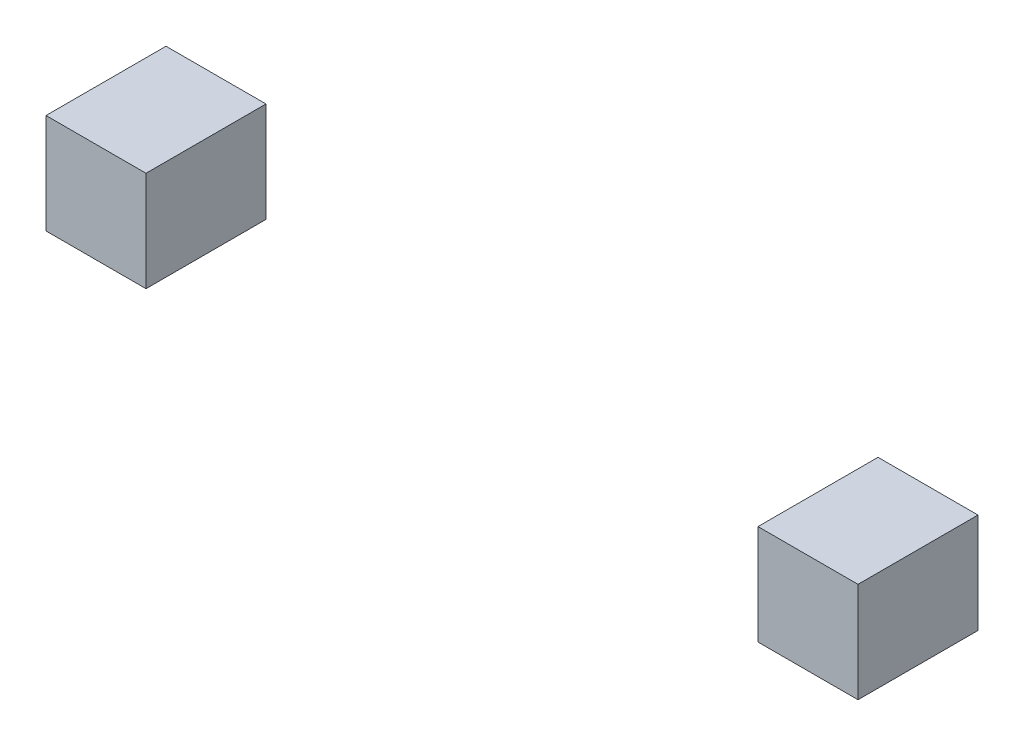
ISO-10303-21;
HEADER;
FILE_DESCRIPTION(('STEP AP214'),'2;1');
FILE_NAME('part.step','',(''),(''),'','','');
FILE_SCHEMA(('AUTOMOTIVE_DESIGN { 1 0 10303 214 1 1 1 1 }'));
ENDSEC;
DATA;
#1=APPLICATION_CONTEXT('core data for automotive mechanical design processes');
#2=APPLICATION_PROTOCOL_DEFINITION('international standard','automotive_design',2000,#1);
#3=PRODUCT_CONTEXT('',#1,'mechanical');
#4=PRODUCT('Part','Part','',(#3));
#5=PRODUCT_RELATED_PRODUCT_CATEGORY('part','',(#4));
#6=PRODUCT_DEFINITION_FORMATION('','',#4);
#7=PRODUCT_DEFINITION_CONTEXT('part definition',#1,'design');
#8=PRODUCT_DEFINITION('design','',#6,#7);
#9=PRODUCT_DEFINITION_SHAPE('','',#8);
#10=(LENGTH_UNIT() NAMED_UNIT(*) SI_UNIT(.MILLI.,.METRE.));
#11=(NAMED_UNIT(*) PLANE_ANGLE_UNIT() SI_UNIT($,.RADIAN.));
#12=(NAMED_UNIT(*) SI_UNIT($,.STERADIAN.) SOLID_ANGLE_UNIT());
#13=UNCERTAINTY_MEASURE_WITH_UNIT(LENGTH_MEASURE(1.E-05),#10,'distance_accuracy_value','');
#14=(GEOMETRIC_REPRESENTATION_CONTEXT(3) GLOBAL_UNCERTAINTY_ASSIGNED_CONTEXT((#13)) GLOBAL_UNIT_ASSIGNED_CONTEXT((#10,
#11,#12)) REPRESENTATION_CONTEXT('',''));
#15=CARTESIAN_POINT('',(0.,0.,0.));
#16=DIRECTION('',(0.,0.,1.));
#17=DIRECTION('',(1.,0.,0.));
#18=AXIS2_PLACEMENT_3D('',#15,#16,#17);
#19=CARTESIAN_POINT('',(-304.,713.79,90.));
#20=DIRECTION('',(1.,0.,0.));
#21=DIRECTION('',(0.,0.,-1.));
#22=AXIS2_PLACEMENT_3D('',#19,#20,#21);
#23=PLANE('',#22);
#24=DIRECTION('',(0.,-1.,0.));
#25=VECTOR('',#24,1.);
#26=CARTESIAN_POINT('',(-304.,713.79,0.));
#27=LINE('',#26,#25);
#28=CARTESIAN_POINT('',(-304.,713.79,0.));
#29=VERTEX_POINT('',#28);
#30=CARTESIAN_POINT('',(-304.,638.79,0.));
#31=VERTEX_POINT('',#30);
#32=EDGE_CURVE('E106',#29,#31,#27,.T.);
#33=ORIENTED_EDGE('',*,*,#32,.T.);
#34=DIRECTION('',(0.,0.,-1.));
#35=VECTOR('',#34,1.);
#36=CARTESIAN_POINT('',(-304.,638.79,90.));
#37=LINE('',#36,#35);
#38=CARTESIAN_POINT('',(-304.,638.79,90.));
#39=VERTEX_POINT('',#38);
#40=EDGE_CURVE('E12',#39,#31,#37,.T.);
#41=ORIENTED_EDGE('',*,*,#40,.F.);
#42=DIRECTION('',(0.,-1.,0.));
#43=VECTOR('',#42,1.);
#44=CARTESIAN_POINT('',(-304.,713.79,90.));
#45=LINE('',#44,#43);
#46=CARTESIAN_POINT('',(-304.,713.79,90.));
#47=VERTEX_POINT('',#46);
#48=EDGE_CURVE('E94',#47,#39,#45,.T.);
#49=ORIENTED_EDGE('',*,*,#48,.F.);
#50=DIRECTION('',(0.,0.,-1.));
#51=VECTOR('',#50,1.);
#52=CARTESIAN_POINT('',(-304.,713.79,90.));
#53=LINE('',#52,#51);
#54=EDGE_CURVE('E102',#47,#29,#53,.T.);
#55=ORIENTED_EDGE('',*,*,#54,.T.);
#56=EDGE_LOOP('',(#33,#41,#49,#55));
#57=FACE_BOUND('',#56,.T.);
#58=ADVANCED_FACE('F43',(#57),#23,.F.);
#59=CARTESIAN_POINT('',(-304.,638.79,90.));
#60=DIRECTION('',(0.,1.,0.));
#61=DIRECTION('',(0.,0.,1.));
#62=AXIS2_PLACEMENT_3D('',#59,#60,#61);
#63=PLANE('',#62);
#64=DIRECTION('',(1.,0.,0.));
#65=VECTOR('',#64,1.);
#66=CARTESIAN_POINT('',(-304.,638.79,0.));
#67=LINE('',#66,#65);
#68=CARTESIAN_POINT('',(-229.,638.79,0.));
#69=VERTEX_POINT('',#68);
#70=EDGE_CURVE('E98',#31,#69,#67,.T.);
#71=ORIENTED_EDGE('',*,*,#70,.T.);
#72=DIRECTION('',(0.,0.,-1.));
#73=VECTOR('',#72,1.);
#74=CARTESIAN_POINT('',(-229.,638.79,90.));
#75=LINE('',#74,#73);
#76=CARTESIAN_POINT('',(-229.,638.79,90.));
#77=VERTEX_POINT('',#76);
#78=EDGE_CURVE('E51',#77,#69,#75,.T.);
#79=ORIENTED_EDGE('',*,*,#78,.F.);
#80=DIRECTION('',(1.,0.,0.));
#81=VECTOR('',#80,1.);
#82=CARTESIAN_POINT('',(-304.,638.79,90.));
#83=LINE('',#82,#81);
#84=EDGE_CURVE('E89',#39,#77,#83,.T.);
#85=ORIENTED_EDGE('',*,*,#84,.F.);
#86=ORIENTED_EDGE('',*,*,#40,.T.);
#87=EDGE_LOOP('',(#71,#79,#85,#86));
#88=FACE_BOUND('',#87,.T.);
#89=ADVANCED_FACE('F97',(#88),#63,.F.);
#90=CARTESIAN_POINT('',(-229.,713.79,90.));
#91=DIRECTION('',(-1.,0.,0.));
#92=DIRECTION('',(0.,0.,1.));
#93=AXIS2_PLACEMENT_3D('',#90,#91,#92);
#94=PLANE('',#93);
#95=DIRECTION('',(0.,1.,0.));
#96=VECTOR('',#95,1.);
#97=CARTESIAN_POINT('',(-229.,713.79,0.));
#98=LINE('',#97,#96);
#99=CARTESIAN_POINT('',(-229.,713.79,0.));
#100=VERTEX_POINT('',#99);
#101=EDGE_CURVE('E76',#69,#100,#98,.T.);
#102=ORIENTED_EDGE('',*,*,#101,.T.);
#103=DIRECTION('',(0.,0.,-1.));
#104=VECTOR('',#103,1.);
#105=CARTESIAN_POINT('',(-229.,713.79,90.));
#106=LINE('',#105,#104);
#107=CARTESIAN_POINT('',(-229.,713.79,90.));
#108=VERTEX_POINT('',#107);
#109=EDGE_CURVE('E99',#108,#100,#106,.T.);
#110=ORIENTED_EDGE('',*,*,#109,.F.);
#111=DIRECTION('',(0.,1.,0.));
#112=VECTOR('',#111,1.);
#113=CARTESIAN_POINT('',(-229.,713.79,90.));
#114=LINE('',#113,#112);
#115=EDGE_CURVE('E92',#77,#108,#114,.T.);
#116=ORIENTED_EDGE('',*,*,#115,.F.);
#117=ORIENTED_EDGE('',*,*,#78,.T.);
#118=EDGE_LOOP('',(#102,#110,#116,#117));
#119=FACE_BOUND('',#118,.T.);
#120=ADVANCED_FACE('F100',(#119),#94,.F.);
#121=CARTESIAN_POINT('',(-304.,713.79,90.));
#122=DIRECTION('',(0.,-1.,0.));
#123=DIRECTION('',(0.,0.,-1.));
#124=AXIS2_PLACEMENT_3D('',#121,#122,#123);
#125=PLANE('',#124);
#126=DIRECTION('',(-1.,0.,0.));
#127=VECTOR('',#126,1.);
#128=CARTESIAN_POINT('',(-304.,713.79,0.));
#129=LINE('',#128,#127);
#130=EDGE_CURVE('E82',#100,#29,#129,.T.);
#131=ORIENTED_EDGE('',*,*,#130,.T.);
#132=ORIENTED_EDGE('',*,*,#54,.F.);
#133=DIRECTION('',(-1.,0.,0.));
#134=VECTOR('',#133,1.);
#135=CARTESIAN_POINT('',(-304.,713.79,90.));
#136=LINE('',#135,#134);
#137=EDGE_CURVE('E59',#108,#47,#136,.T.);
#138=ORIENTED_EDGE('',*,*,#137,.F.);
#139=ORIENTED_EDGE('',*,*,#109,.T.);
#140=EDGE_LOOP('',(#131,#132,#138,#139));
#141=FACE_BOUND('',#140,.T.);
#142=ADVANCED_FACE('F113',(#141),#125,.F.);
#143=CARTESIAN_POINT('',(-304.,638.79,90.));
#144=DIRECTION('',(0.,0.,1.));
#145=DIRECTION('',(1.,0.,0.));
#146=AXIS2_PLACEMENT_3D('',#143,#144,#145);
#147=PLANE('',#146);
#148=ORIENTED_EDGE('',*,*,#48,.T.);
#149=ORIENTED_EDGE('',*,*,#84,.T.);
#150=ORIENTED_EDGE('',*,*,#115,.T.);
#151=ORIENTED_EDGE('',*,*,#137,.T.);
#152=EDGE_LOOP('',(#148,#149,#150,#151));
#153=FACE_BOUND('',#152,.T.);
#154=ADVANCED_FACE('F90',(#153),#147,.T.);
#155=CARTESIAN_POINT('',(-304.,638.79,0.));
#156=DIRECTION('',(0.,0.,1.));
#157=DIRECTION('',(1.,0.,0.));
#158=AXIS2_PLACEMENT_3D('',#155,#156,#157);
#159=PLANE('',#158);
#160=ORIENTED_EDGE('',*,*,#32,.F.);
#161=ORIENTED_EDGE('',*,*,#130,.F.);
#162=ORIENTED_EDGE('',*,*,#101,.F.);
#163=ORIENTED_EDGE('',*,*,#70,.F.);
#164=EDGE_LOOP('',(#160,#161,#162,#163));
#165=FACE_BOUND('',#164,.T.);
#166=ADVANCED_FACE('F116',(#165),#159,.F.);
#167=CLOSED_SHELL('',(#58,#89,#120,#142,#154,#166));
#168=MANIFOLD_SOLID_BREP('B2',#167);
#169=CARTESIAN_POINT('',(305.,713.79,90.));
#170=DIRECTION('',(-1.,0.,0.));
#171=DIRECTION('',(0.,0.,1.));
#172=AXIS2_PLACEMENT_3D('',#169,#170,#171);
#173=PLANE('',#172);
#174=DIRECTION('',(0.,1.,0.));
#175=VECTOR('',#174,1.);
#176=CARTESIAN_POINT('',(305.,713.79,0.));
#177=LINE('',#176,#175);
#178=CARTESIAN_POINT('',(305.,638.79,0.));
#179=VERTEX_POINT('',#178);
#180=CARTESIAN_POINT('',(305.,713.79,0.));
#181=VERTEX_POINT('',#180);
#182=EDGE_CURVE('E230',#179,#181,#177,.T.);
#183=ORIENTED_EDGE('',*,*,#182,.T.);
#184=DIRECTION('',(0.,0.,-1.));
#185=VECTOR('',#184,1.);
#186=CARTESIAN_POINT('',(305.,713.79,90.));
#187=LINE('',#186,#185);
#188=CARTESIAN_POINT('',(305.,713.79,90.));
#189=VERTEX_POINT('',#188);
#190=EDGE_CURVE('E41',#189,#181,#187,.T.);
#191=ORIENTED_EDGE('',*,*,#190,.F.);
#192=DIRECTION('',(0.,1.,0.));
#193=VECTOR('',#192,1.);
#194=CARTESIAN_POINT('',(305.,713.79,90.));
#195=LINE('',#194,#193);
#196=CARTESIAN_POINT('',(305.,638.79,90.));
#197=VERTEX_POINT('',#196);
#198=EDGE_CURVE('E218',#197,#189,#195,.T.);
#199=ORIENTED_EDGE('',*,*,#198,.F.);
#200=DIRECTION('',(0.,0.,-1.));
#201=VECTOR('',#200,1.);
#202=CARTESIAN_POINT('',(305.,638.79,90.));
#203=LINE('',#202,#201);
#204=EDGE_CURVE('E226',#197,#179,#203,.T.);
#205=ORIENTED_EDGE('',*,*,#204,.T.);
#206=EDGE_LOOP('',(#183,#191,#199,#205));
#207=FACE_BOUND('',#206,.T.);
#208=ADVANCED_FACE('F167',(#207),#173,.F.);
#209=CARTESIAN_POINT('',(305.,713.79,90.));
#210=DIRECTION('',(0.,-1.,0.));
#211=DIRECTION('',(0.,0.,-1.));
#212=AXIS2_PLACEMENT_3D('',#209,#210,#211);
#213=PLANE('',#212);
#214=DIRECTION('',(-1.,0.,0.));
#215=VECTOR('',#214,1.);
#216=CARTESIAN_POINT('',(305.,713.79,0.));
#217=LINE('',#216,#215);
#218=CARTESIAN_POINT('',(230.,713.79,0.));
#219=VERTEX_POINT('',#218);
#220=EDGE_CURVE('E222',#181,#219,#217,.T.);
#221=ORIENTED_EDGE('',*,*,#220,.T.);
#222=DIRECTION('',(0.,0.,-1.));
#223=VECTOR('',#222,1.);
#224=CARTESIAN_POINT('',(230.,713.79,90.));
#225=LINE('',#224,#223);
#226=CARTESIAN_POINT('',(230.,713.79,90.));
#227=VERTEX_POINT('',#226);
#228=EDGE_CURVE('E175',#227,#219,#225,.T.);
#229=ORIENTED_EDGE('',*,*,#228,.F.);
#230=DIRECTION('',(-1.,0.,0.));
#231=VECTOR('',#230,1.);
#232=CARTESIAN_POINT('',(305.,713.79,90.));
#233=LINE('',#232,#231);
#234=EDGE_CURVE('E213',#189,#227,#233,.T.);
#235=ORIENTED_EDGE('',*,*,#234,.F.);
#236=ORIENTED_EDGE('',*,*,#190,.T.);
#237=EDGE_LOOP('',(#221,#229,#235,#236));
#238=FACE_BOUND('',#237,.T.);
#239=ADVANCED_FACE('F221',(#238),#213,.F.);
#240=CARTESIAN_POINT('',(230.,713.79,90.));
#241=DIRECTION('',(1.,0.,0.));
#242=DIRECTION('',(0.,0.,-1.));
#243=AXIS2_PLACEMENT_3D('',#240,#241,#242);
#244=PLANE('',#243);
#245=DIRECTION('',(0.,-1.,0.));
#246=VECTOR('',#245,1.);
#247=CARTESIAN_POINT('',(230.,713.79,0.));
#248=LINE('',#247,#246);
#249=CARTESIAN_POINT('',(230.,638.79,0.));
#250=VERTEX_POINT('',#249);
#251=EDGE_CURVE('E200',#219,#250,#248,.T.);
#252=ORIENTED_EDGE('',*,*,#251,.T.);
#253=DIRECTION('',(0.,0.,-1.));
#254=VECTOR('',#253,1.);
#255=CARTESIAN_POINT('',(230.,638.79,90.));
#256=LINE('',#255,#254);
#257=CARTESIAN_POINT('',(230.,638.79,90.));
#258=VERTEX_POINT('',#257);
#259=EDGE_CURVE('E223',#258,#250,#256,.T.);
#260=ORIENTED_EDGE('',*,*,#259,.F.);
#261=DIRECTION('',(0.,-1.,0.));
#262=VECTOR('',#261,1.);
#263=CARTESIAN_POINT('',(230.,713.79,90.));
#264=LINE('',#263,#262);
#265=EDGE_CURVE('E216',#227,#258,#264,.T.);
#266=ORIENTED_EDGE('',*,*,#265,.F.);
#267=ORIENTED_EDGE('',*,*,#228,.T.);
#268=EDGE_LOOP('',(#252,#260,#266,#267));
#269=FACE_BOUND('',#268,.T.);
#270=ADVANCED_FACE('F224',(#269),#244,.F.);
#271=CARTESIAN_POINT('',(305.,638.79,90.));
#272=DIRECTION('',(0.,1.,0.));
#273=DIRECTION('',(0.,0.,1.));
#274=AXIS2_PLACEMENT_3D('',#271,#272,#273);
#275=PLANE('',#274);
#276=DIRECTION('',(1.,0.,0.));
#277=VECTOR('',#276,1.);
#278=CARTESIAN_POINT('',(305.,638.79,0.));
#279=LINE('',#278,#277);
#280=EDGE_CURVE('E206',#250,#179,#279,.T.);
#281=ORIENTED_EDGE('',*,*,#280,.T.);
#282=ORIENTED_EDGE('',*,*,#204,.F.);
#283=DIRECTION('',(1.,0.,0.));
#284=VECTOR('',#283,1.);
#285=CARTESIAN_POINT('',(305.,638.79,90.));
#286=LINE('',#285,#284);
#287=EDGE_CURVE('E183',#258,#197,#286,.T.);
#288=ORIENTED_EDGE('',*,*,#287,.F.);
#289=ORIENTED_EDGE('',*,*,#259,.T.);
#290=EDGE_LOOP('',(#281,#282,#288,#289));
#291=FACE_BOUND('',#290,.T.);
#292=ADVANCED_FACE('F237',(#291),#275,.F.);
#293=CARTESIAN_POINT('',(305.,638.79,90.));
#294=DIRECTION('',(0.,0.,-1.));
#295=DIRECTION('',(-1.,0.,0.));
#296=AXIS2_PLACEMENT_3D('',#293,#294,#295);
#297=PLANE('',#296);
#298=ORIENTED_EDGE('',*,*,#198,.T.);
#299=ORIENTED_EDGE('',*,*,#234,.T.);
#300=ORIENTED_EDGE('',*,*,#265,.T.);
#301=ORIENTED_EDGE('',*,*,#287,.T.);
#302=EDGE_LOOP('',(#298,#299,#300,#301));
#303=FACE_BOUND('',#302,.T.);
#304=ADVANCED_FACE('F214',(#303),#297,.F.);
#305=CARTESIAN_POINT('',(305.,638.79,0.));
#306=DIRECTION('',(0.,0.,-1.));
#307=DIRECTION('',(-1.,0.,0.));
#308=AXIS2_PLACEMENT_3D('',#305,#306,#307);
#309=PLANE('',#308);
#310=ORIENTED_EDGE('',*,*,#182,.F.);
#311=ORIENTED_EDGE('',*,*,#280,.F.);
#312=ORIENTED_EDGE('',*,*,#251,.F.);
#313=ORIENTED_EDGE('',*,*,#220,.F.);
#314=EDGE_LOOP('',(#310,#311,#312,#313));
#315=FACE_BOUND('',#314,.T.);
#316=ADVANCED_FACE('F240',(#315),#309,.T.);
#317=CLOSED_SHELL('',(#208,#239,#270,#292,#304,#316));
#318=MANIFOLD_SOLID_BREP('B6',#317);
#319=ADVANCED_BREP_SHAPE_REPRESENTATION('',(#18,#168,#318),#14);
#320=SHAPE_DEFINITION_REPRESENTATION(#9,#319);
ENDSEC;
END-ISO-10303-21;
